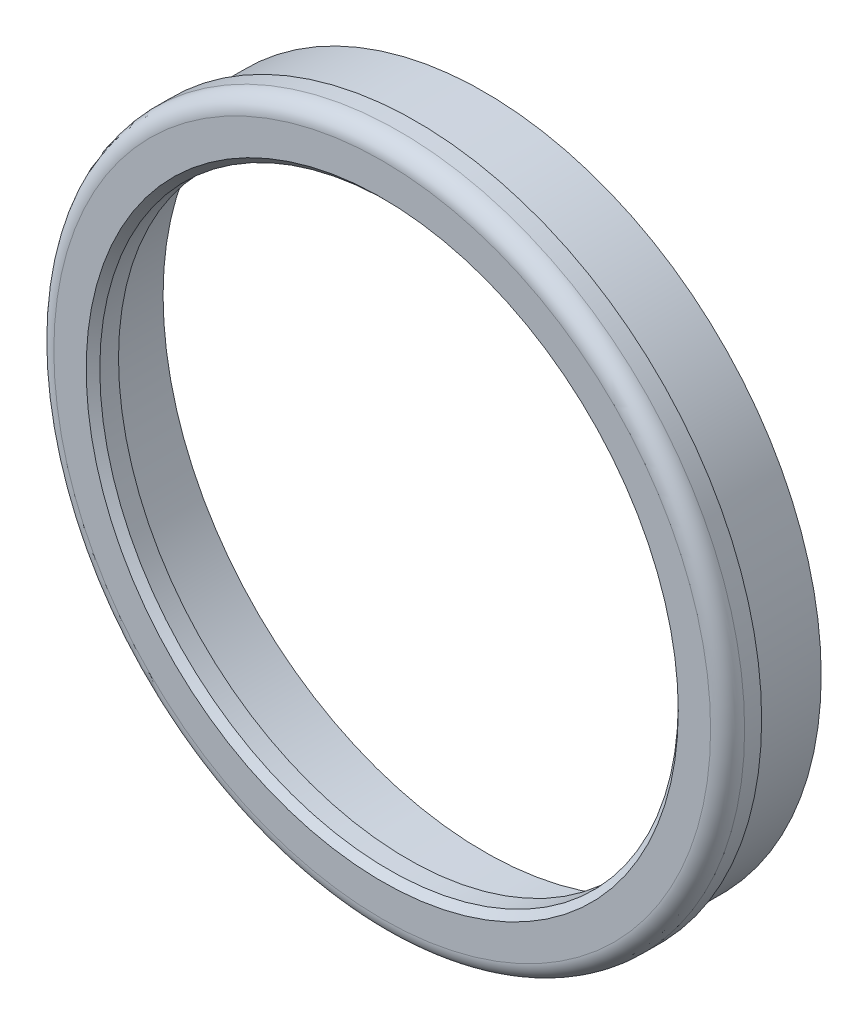
ISO-10303-21;
HEADER;
FILE_DESCRIPTION(('STEP AP214'),'2;1');
FILE_NAME('part.step','',(''),(''),'','','');
FILE_SCHEMA(('AUTOMOTIVE_DESIGN { 1 0 10303 214 1 1 1 1 }'));
ENDSEC;
DATA;
#1=APPLICATION_CONTEXT('core data for automotive mechanical design processes');
#2=APPLICATION_PROTOCOL_DEFINITION('international standard','automotive_design',2000,#1);
#3=PRODUCT_CONTEXT('',#1,'mechanical');
#4=PRODUCT('Part','Part','',(#3));
#5=PRODUCT_RELATED_PRODUCT_CATEGORY('part','',(#4));
#6=PRODUCT_DEFINITION_FORMATION('','',#4);
#7=PRODUCT_DEFINITION_CONTEXT('part definition',#1,'design');
#8=PRODUCT_DEFINITION('design','',#6,#7);
#9=PRODUCT_DEFINITION_SHAPE('','',#8);
#10=(LENGTH_UNIT() NAMED_UNIT(*) SI_UNIT(.MILLI.,.METRE.));
#11=(NAMED_UNIT(*) PLANE_ANGLE_UNIT() SI_UNIT($,.RADIAN.));
#12=(NAMED_UNIT(*) SI_UNIT($,.STERADIAN.) SOLID_ANGLE_UNIT());
#13=UNCERTAINTY_MEASURE_WITH_UNIT(LENGTH_MEASURE(1.E-05),#10,'distance_accuracy_value','');
#14=(GEOMETRIC_REPRESENTATION_CONTEXT(3) GLOBAL_UNCERTAINTY_ASSIGNED_CONTEXT((#13)) GLOBAL_UNIT_ASSIGNED_CONTEXT((#10,
#11,#12)) REPRESENTATION_CONTEXT('',''));
#15=CARTESIAN_POINT('',(0.,0.,0.));
#16=DIRECTION('',(0.,0.,1.));
#17=DIRECTION('',(1.,0.,0.));
#18=AXIS2_PLACEMENT_3D('',#15,#16,#17);
#19=CARTESIAN_POINT('',(0.,0.,-2.));
#20=DIRECTION('',(0.,0.,1.));
#21=DIRECTION('',(1.,0.,0.));
#22=AXIS2_PLACEMENT_3D('',#19,#20,#21);
#23=CYLINDRICAL_SURFACE('',#22,17.);
#24=CARTESIAN_POINT('',(0.,0.,-0.400000000000005));
#25=DIRECTION('',(0.,0.,1.));
#26=DIRECTION('',(1.,0.,0.));
#27=AXIS2_PLACEMENT_3D('',#24,#25,#26);
#28=CIRCLE('',#27,17.);
#29=CARTESIAN_POINT('',(17.,0.,-0.400000000000005));
#30=VERTEX_POINT('',#29);
#31=EDGE_CURVE('E46',#30,#30,#28,.T.);
#32=ORIENTED_EDGE('',*,*,#31,.T.);
#33=EDGE_LOOP('',(#32));
#34=FACE_BOUND('',#33,.T.);
#35=CARTESIAN_POINT('',(0.,0.,-1.5));
#36=DIRECTION('',(0.,0.,-1.));
#37=DIRECTION('',(-1.,0.,0.));
#38=AXIS2_PLACEMENT_3D('',#35,#36,#37);
#39=CIRCLE('',#38,17.);
#40=CARTESIAN_POINT('',(-17.,0.,-1.5));
#41=VERTEX_POINT('',#40);
#42=EDGE_CURVE('E49',#41,#41,#39,.F.);
#43=ORIENTED_EDGE('',*,*,#42,.F.);
#44=EDGE_LOOP('',(#43));
#45=FACE_BOUND('',#44,.T.);
#46=ADVANCED_FACE('F31',(#34,#45),#23,.F.);
#47=CARTESIAN_POINT('',(0.,0.,-2.));
#48=DIRECTION('',(0.,0.,1.));
#49=DIRECTION('',(1.,0.,0.));
#50=AXIS2_PLACEMENT_3D('',#47,#48,#49);
#51=CYLINDRICAL_SURFACE('',#50,20.3);
#52=CARTESIAN_POINT('',(0.,0.,-1.));
#53=DIRECTION('',(0.,0.,1.));
#54=DIRECTION('',(1.,0.,0.));
#55=AXIS2_PLACEMENT_3D('',#52,#53,#54);
#56=CIRCLE('',#55,20.3);
#57=CARTESIAN_POINT('',(20.3,0.,-1.));
#58=VERTEX_POINT('',#57);
#59=EDGE_CURVE('E10',#58,#58,#56,.F.);
#60=ORIENTED_EDGE('',*,*,#59,.T.);
#61=EDGE_LOOP('',(#60));
#62=FACE_BOUND('',#61,.T.);
#63=CARTESIAN_POINT('',(0.,0.,-2.));
#64=DIRECTION('',(0.,0.,1.));
#65=DIRECTION('',(1.,0.,0.));
#66=AXIS2_PLACEMENT_3D('',#63,#64,#65);
#67=CIRCLE('',#66,20.3);
#68=CARTESIAN_POINT('',(20.3,0.,-2.));
#69=VERTEX_POINT('',#68);
#70=EDGE_CURVE('E59',#69,#69,#67,.T.);
#71=ORIENTED_EDGE('',*,*,#70,.T.);
#72=EDGE_LOOP('',(#71));
#73=FACE_BOUND('',#72,.T.);
#74=ADVANCED_FACE('F90',(#62,#73),#51,.T.);
#75=CARTESIAN_POINT('',(0.,0.,-2.));
#76=DIRECTION('',(0.,0.,1.));
#77=DIRECTION('',(1.,0.,0.));
#78=AXIS2_PLACEMENT_3D('',#75,#76,#77);
#79=PLANE('',#78);
#80=CARTESIAN_POINT('',(0.,0.,-2.));
#81=DIRECTION('',(0.,0.,1.));
#82=DIRECTION('',(1.,0.,0.));
#83=AXIS2_PLACEMENT_3D('',#80,#81,#82);
#84=CIRCLE('',#83,19.8);
#85=CARTESIAN_POINT('',(19.8,0.,-2.));
#86=VERTEX_POINT('',#85);
#87=EDGE_CURVE('E56',#86,#86,#84,.F.);
#88=ORIENTED_EDGE('',*,*,#87,.F.);
#89=EDGE_LOOP('',(#88));
#90=FACE_BOUND('',#89,.T.);
#91=ORIENTED_EDGE('',*,*,#70,.F.);
#92=EDGE_LOOP('',(#91));
#93=FACE_BOUND('',#92,.T.);
#94=ADVANCED_FACE('F96',(#90,#93),#79,.F.);
#95=CARTESIAN_POINT('',(0.,0.,0.));
#96=DIRECTION('',(0.,0.,1.));
#97=DIRECTION('',(1.,0.,0.));
#98=AXIS2_PLACEMENT_3D('',#95,#96,#97);
#99=PLANE('',#98);
#100=CARTESIAN_POINT('',(0.,0.,0.));
#101=DIRECTION('',(0.,0.,1.));
#102=DIRECTION('',(1.,0.,0.));
#103=AXIS2_PLACEMENT_3D('',#100,#101,#102);
#104=CIRCLE('',#103,19.3);
#105=CARTESIAN_POINT('',(19.3,0.,0.));
#106=VERTEX_POINT('',#105);
#107=EDGE_CURVE('E38',#106,#106,#104,.T.);
#108=ORIENTED_EDGE('',*,*,#107,.T.);
#109=EDGE_LOOP('',(#108));
#110=FACE_BOUND('',#109,.T.);
#111=CARTESIAN_POINT('',(0.,0.,0.));
#112=DIRECTION('',(0.,0.,1.));
#113=DIRECTION('',(1.,0.,0.));
#114=AXIS2_PLACEMENT_3D('',#111,#112,#113);
#115=CIRCLE('',#114,17.4);
#116=CARTESIAN_POINT('',(17.4,0.,0.));
#117=VERTEX_POINT('',#116);
#118=EDGE_CURVE('E42',#117,#117,#115,.F.);
#119=ORIENTED_EDGE('',*,*,#118,.T.);
#120=EDGE_LOOP('',(#119));
#121=FACE_BOUND('',#120,.T.);
#122=ADVANCED_FACE('F102',(#110,#121),#99,.T.);
#123=CARTESIAN_POINT('',(0.,0.,-6.));
#124=DIRECTION('',(0.,0.,-1.));
#125=DIRECTION('',(-1.,0.,0.));
#126=AXIS2_PLACEMENT_3D('',#123,#124,#125);
#127=PLANE('',#126);
#128=CARTESIAN_POINT('',(0.,0.,-6.));
#129=DIRECTION('',(0.,0.,-1.));
#130=DIRECTION('',(-1.,0.,0.));
#131=AXIS2_PLACEMENT_3D('',#128,#129,#130);
#132=CIRCLE('',#131,19.8);
#133=CARTESIAN_POINT('',(-19.8,0.,-6.));
#134=VERTEX_POINT('',#133);
#135=EDGE_CURVE('E62',#134,#134,#132,.T.);
#136=ORIENTED_EDGE('',*,*,#135,.T.);
#137=EDGE_LOOP('',(#136));
#138=FACE_BOUND('',#137,.T.);
#139=CARTESIAN_POINT('',(0.,0.,-6.));
#140=DIRECTION('',(0.,0.,-1.));
#141=DIRECTION('',(-1.,0.,0.));
#142=AXIS2_PLACEMENT_3D('',#139,#140,#141);
#143=CIRCLE('',#142,18.88);
#144=CARTESIAN_POINT('',(-18.88,0.,-6.));
#145=VERTEX_POINT('',#144);
#146=EDGE_CURVE('E51',#145,#145,#143,.T.);
#147=ORIENTED_EDGE('',*,*,#146,.F.);
#148=EDGE_LOOP('',(#147));
#149=FACE_BOUND('',#148,.T.);
#150=ADVANCED_FACE('F84',(#138,#149),#127,.T.);
#151=CARTESIAN_POINT('',(0.,0.,-6.));
#152=DIRECTION('',(0.,0.,1.));
#153=DIRECTION('',(1.,0.,0.));
#154=AXIS2_PLACEMENT_3D('',#151,#152,#153);
#155=CYLINDRICAL_SURFACE('',#154,19.8);
#156=ORIENTED_EDGE('',*,*,#135,.F.);
#157=EDGE_LOOP('',(#156));
#158=FACE_BOUND('',#157,.T.);
#159=ORIENTED_EDGE('',*,*,#87,.T.);
#160=EDGE_LOOP('',(#159));
#161=FACE_BOUND('',#160,.T.);
#162=ADVANCED_FACE('F76',(#158,#161),#155,.T.);
#163=CARTESIAN_POINT('',(0.,0.,-6.));
#164=DIRECTION('',(0.,0.,1.));
#165=DIRECTION('',(1.,0.,0.));
#166=AXIS2_PLACEMENT_3D('',#163,#164,#165);
#167=CYLINDRICAL_SURFACE('',#166,18.88);
#168=ORIENTED_EDGE('',*,*,#146,.T.);
#169=EDGE_LOOP('',(#168));
#170=FACE_BOUND('',#169,.T.);
#171=CARTESIAN_POINT('',(0.,0.,-1.5));
#172=DIRECTION('',(0.,0.,-1.));
#173=DIRECTION('',(-1.,0.,0.));
#174=AXIS2_PLACEMENT_3D('',#171,#172,#173);
#175=CIRCLE('',#174,18.88);
#176=CARTESIAN_POINT('',(-18.88,0.,-1.5));
#177=VERTEX_POINT('',#176);
#178=EDGE_CURVE('E52',#177,#177,#175,.T.);
#179=ORIENTED_EDGE('',*,*,#178,.F.);
#180=EDGE_LOOP('',(#179));
#181=FACE_BOUND('',#180,.T.);
#182=ADVANCED_FACE('F73',(#170,#181),#167,.F.);
#183=CARTESIAN_POINT('',(0.,0.,-0.400000000000005));
#184=DIRECTION('',(0.,0.,1.));
#185=DIRECTION('',(1.,0.,0.));
#186=AXIS2_PLACEMENT_3D('',#183,#184,#185);
#187=CONICAL_SURFACE('',#186,17.,0.785398163397453);
#188=ORIENTED_EDGE('',*,*,#118,.F.);
#189=EDGE_LOOP('',(#188));
#190=FACE_BOUND('',#189,.T.);
#191=ORIENTED_EDGE('',*,*,#31,.F.);
#192=EDGE_LOOP('',(#191));
#193=FACE_BOUND('',#192,.T.);
#194=ADVANCED_FACE('F75',(#190,#193),#187,.F.);
#195=CARTESIAN_POINT('',(0.,0.,-1.5));
#196=DIRECTION('',(0.,0.,-1.));
#197=DIRECTION('',(-1.,0.,0.));
#198=AXIS2_PLACEMENT_3D('',#195,#196,#197);
#199=PLANE('',#198);
#200=ORIENTED_EDGE('',*,*,#178,.T.);
#201=EDGE_LOOP('',(#200));
#202=FACE_BOUND('',#201,.T.);
#203=ORIENTED_EDGE('',*,*,#42,.T.);
#204=EDGE_LOOP('',(#203));
#205=FACE_BOUND('',#204,.T.);
#206=ADVANCED_FACE('F70',(#202,#205),#199,.T.);
#207=CARTESIAN_POINT('',(0.,0.,-1.));
#208=DIRECTION('',(0.,0.,1.));
#209=DIRECTION('',(1.,0.,0.));
#210=AXIS2_PLACEMENT_3D('',#207,#208,#209);
#211=TOROIDAL_SURFACE('',#210,19.3,1.);
#212=ORIENTED_EDGE('',*,*,#59,.F.);
#213=EDGE_LOOP('',(#212));
#214=FACE_BOUND('',#213,.T.);
#215=ORIENTED_EDGE('',*,*,#107,.F.);
#216=EDGE_LOOP('',(#215));
#217=FACE_BOUND('',#216,.T.);
#218=ADVANCED_FACE('F33',(#214,#217),#211,.T.);
#219=CLOSED_SHELL('',(#46,#74,#94,#122,#150,#162,#182,#194,#206,#218));
#220=MANIFOLD_SOLID_BREP('B2',#219);
#221=ADVANCED_BREP_SHAPE_REPRESENTATION('',(#18,#220),#14);
#222=SHAPE_DEFINITION_REPRESENTATION(#9,#221);
ENDSEC;
END-ISO-10303-21;
